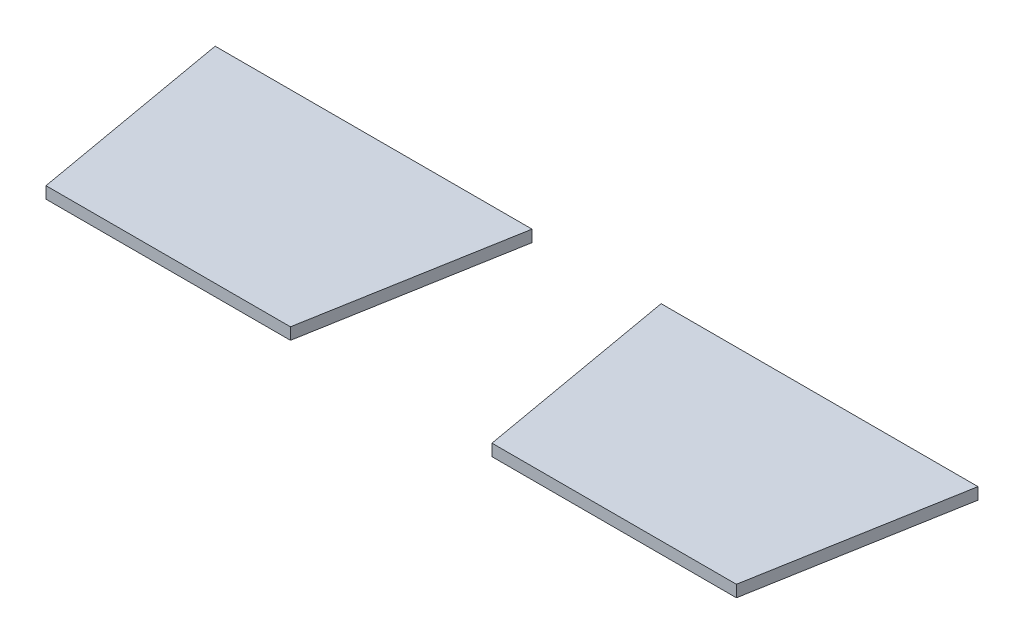
ISO-10303-21;
HEADER;
FILE_DESCRIPTION(('STEP AP214'),'2;1');
FILE_NAME('part.step','',(''),(''),'','','');
FILE_SCHEMA(('AUTOMOTIVE_DESIGN { 1 0 10303 214 1 1 1 1 }'));
ENDSEC;
DATA;
#1=APPLICATION_CONTEXT('core data for automotive mechanical design processes');
#2=APPLICATION_PROTOCOL_DEFINITION('international standard','automotive_design',2000,#1);
#3=PRODUCT_CONTEXT('',#1,'mechanical');
#4=PRODUCT('Part','Part','',(#3));
#5=PRODUCT_RELATED_PRODUCT_CATEGORY('part','',(#4));
#6=PRODUCT_DEFINITION_FORMATION('','',#4);
#7=PRODUCT_DEFINITION_CONTEXT('part definition',#1,'design');
#8=PRODUCT_DEFINITION('design','',#6,#7);
#9=PRODUCT_DEFINITION_SHAPE('','',#8);
#10=(LENGTH_UNIT() NAMED_UNIT(*) SI_UNIT(.MILLI.,.METRE.));
#11=(NAMED_UNIT(*) PLANE_ANGLE_UNIT() SI_UNIT($,.RADIAN.));
#12=(NAMED_UNIT(*) SI_UNIT($,.STERADIAN.) SOLID_ANGLE_UNIT());
#13=UNCERTAINTY_MEASURE_WITH_UNIT(LENGTH_MEASURE(1.E-05),#10,'distance_accuracy_value','');
#14=(GEOMETRIC_REPRESENTATION_CONTEXT(3) GLOBAL_UNCERTAINTY_ASSIGNED_CONTEXT((#13)) GLOBAL_UNIT_ASSIGNED_CONTEXT((#10,
#11,#12)) REPRESENTATION_CONTEXT('',''));
#15=CARTESIAN_POINT('',(0.,0.,0.));
#16=DIRECTION('',(0.,0.,1.));
#17=DIRECTION('',(1.,0.,0.));
#18=AXIS2_PLACEMENT_3D('',#15,#16,#17);
#19=CARTESIAN_POINT('',(65.,2.,-17.5));
#20=DIRECTION('',(0.,0.,1.));
#21=DIRECTION('',(1.,0.,0.));
#22=AXIS2_PLACEMENT_3D('',#19,#20,#21);
#23=PLANE('',#22);
#24=DIRECTION('',(-1.,0.,0.));
#25=VECTOR('',#24,1.);
#26=CARTESIAN_POINT('',(65.,0.,-17.5));
#27=LINE('',#26,#25);
#28=CARTESIAN_POINT('',(65.,0.,-17.5));
#29=VERTEX_POINT('',#28);
#30=CARTESIAN_POINT('',(11.,0.,-17.5));
#31=VERTEX_POINT('',#30);
#32=EDGE_CURVE('E106',#29,#31,#27,.T.);
#33=ORIENTED_EDGE('',*,*,#32,.T.);
#34=DIRECTION('',(0.,-1.,0.));
#35=VECTOR('',#34,1.);
#36=CARTESIAN_POINT('',(11.,2.,-17.5));
#37=LINE('',#36,#35);
#38=CARTESIAN_POINT('',(11.,2.,-17.5));
#39=VERTEX_POINT('',#38);
#40=EDGE_CURVE('E12',#39,#31,#37,.T.);
#41=ORIENTED_EDGE('',*,*,#40,.F.);
#42=DIRECTION('',(-1.,0.,0.));
#43=VECTOR('',#42,1.);
#44=CARTESIAN_POINT('',(65.,2.,-17.5));
#45=LINE('',#44,#43);
#46=CARTESIAN_POINT('',(65.,2.,-17.5));
#47=VERTEX_POINT('',#46);
#48=EDGE_CURVE('E94',#47,#39,#45,.T.);
#49=ORIENTED_EDGE('',*,*,#48,.F.);
#50=DIRECTION('',(0.,-1.,0.));
#51=VECTOR('',#50,1.);
#52=CARTESIAN_POINT('',(65.,2.,-17.5));
#53=LINE('',#52,#51);
#54=EDGE_CURVE('E102',#47,#29,#53,.T.);
#55=ORIENTED_EDGE('',*,*,#54,.T.);
#56=EDGE_LOOP('',(#33,#41,#49,#55));
#57=FACE_BOUND('',#56,.T.);
#58=ADVANCED_FACE('F43',(#57),#23,.F.);
#59=CARTESIAN_POINT('',(11.,2.,-17.5));
#60=DIRECTION('',(0.984807753012207,0.,-0.173648177666934));
#61=DIRECTION('',(-0.173648177666934,0.,-0.984807753012207));
#62=AXIS2_PLACEMENT_3D('',#59,#60,#61);
#63=PLANE('',#62);
#64=DIRECTION('',(0.173648177666934,0.,0.984807753012207));
#65=VECTOR('',#64,1.);
#66=CARTESIAN_POINT('',(11.,0.,-17.5));
#67=LINE('',#66,#65);
#68=CARTESIAN_POINT('',(17.1714443247964,0.,17.5));
#69=VERTEX_POINT('',#68);
#70=EDGE_CURVE('E98',#31,#69,#67,.T.);
#71=ORIENTED_EDGE('',*,*,#70,.T.);
#72=DIRECTION('',(0.,-1.,0.));
#73=VECTOR('',#72,1.);
#74=CARTESIAN_POINT('',(17.1714443247964,2.,17.5));
#75=LINE('',#74,#73);
#76=CARTESIAN_POINT('',(17.1714443247964,2.,17.5));
#77=VERTEX_POINT('',#76);
#78=EDGE_CURVE('E51',#77,#69,#75,.T.);
#79=ORIENTED_EDGE('',*,*,#78,.F.);
#80=DIRECTION('',(0.173648177666934,0.,0.984807753012207));
#81=VECTOR('',#80,1.);
#82=CARTESIAN_POINT('',(11.,2.,-17.5));
#83=LINE('',#82,#81);
#84=EDGE_CURVE('E89',#39,#77,#83,.T.);
#85=ORIENTED_EDGE('',*,*,#84,.F.);
#86=ORIENTED_EDGE('',*,*,#40,.T.);
#87=EDGE_LOOP('',(#71,#79,#85,#86));
#88=FACE_BOUND('',#87,.T.);
#89=ADVANCED_FACE('F97',(#88),#63,.F.);
#90=CARTESIAN_POINT('',(58.8285556752037,2.,17.5));
#91=DIRECTION('',(0.,0.,-1.));
#92=DIRECTION('',(-1.,0.,0.));
#93=AXIS2_PLACEMENT_3D('',#90,#91,#92);
#94=PLANE('',#93);
#95=DIRECTION('',(1.,0.,0.));
#96=VECTOR('',#95,1.);
#97=CARTESIAN_POINT('',(58.8285556752037,0.,17.5));
#98=LINE('',#97,#96);
#99=CARTESIAN_POINT('',(58.8285556752037,0.,17.5));
#100=VERTEX_POINT('',#99);
#101=EDGE_CURVE('E76',#69,#100,#98,.T.);
#102=ORIENTED_EDGE('',*,*,#101,.T.);
#103=DIRECTION('',(0.,-1.,0.));
#104=VECTOR('',#103,1.);
#105=CARTESIAN_POINT('',(58.8285556752037,2.,17.5));
#106=LINE('',#105,#104);
#107=CARTESIAN_POINT('',(58.8285556752037,2.,17.5));
#108=VERTEX_POINT('',#107);
#109=EDGE_CURVE('E99',#108,#100,#106,.T.);
#110=ORIENTED_EDGE('',*,*,#109,.F.);
#111=DIRECTION('',(1.,0.,0.));
#112=VECTOR('',#111,1.);
#113=CARTESIAN_POINT('',(58.8285556752037,2.,17.5));
#114=LINE('',#113,#112);
#115=EDGE_CURVE('E92',#77,#108,#114,.T.);
#116=ORIENTED_EDGE('',*,*,#115,.F.);
#117=ORIENTED_EDGE('',*,*,#78,.T.);
#118=EDGE_LOOP('',(#102,#110,#116,#117));
#119=FACE_BOUND('',#118,.T.);
#120=ADVANCED_FACE('F100',(#119),#94,.F.);
#121=CARTESIAN_POINT('',(65.,2.,-17.5));
#122=DIRECTION('',(-0.984807753012208,0.,-0.173648177666931));
#123=DIRECTION('',(-0.173648177666931,0.,0.984807753012208));
#124=AXIS2_PLACEMENT_3D('',#121,#122,#123);
#125=PLANE('',#124);
#126=DIRECTION('',(0.173648177666931,0.,-0.984807753012208));
#127=VECTOR('',#126,1.);
#128=CARTESIAN_POINT('',(65.,0.,-17.5));
#129=LINE('',#128,#127);
#130=EDGE_CURVE('E82',#100,#29,#129,.T.);
#131=ORIENTED_EDGE('',*,*,#130,.T.);
#132=ORIENTED_EDGE('',*,*,#54,.F.);
#133=DIRECTION('',(0.173648177666931,0.,-0.984807753012208));
#134=VECTOR('',#133,1.);
#135=CARTESIAN_POINT('',(65.,2.,-17.5));
#136=LINE('',#135,#134);
#137=EDGE_CURVE('E59',#108,#47,#136,.T.);
#138=ORIENTED_EDGE('',*,*,#137,.F.);
#139=ORIENTED_EDGE('',*,*,#109,.T.);
#140=EDGE_LOOP('',(#131,#132,#138,#139));
#141=FACE_BOUND('',#140,.T.);
#142=ADVANCED_FACE('F113',(#141),#125,.F.);
#143=CARTESIAN_POINT('',(0.,2.,0.));
#144=DIRECTION('',(0.,1.,0.));
#145=DIRECTION('',(0.,0.,1.));
#146=AXIS2_PLACEMENT_3D('',#143,#144,#145);
#147=PLANE('',#146);
#148=ORIENTED_EDGE('',*,*,#48,.T.);
#149=ORIENTED_EDGE('',*,*,#84,.T.);
#150=ORIENTED_EDGE('',*,*,#115,.T.);
#151=ORIENTED_EDGE('',*,*,#137,.T.);
#152=EDGE_LOOP('',(#148,#149,#150,#151));
#153=FACE_BOUND('',#152,.T.);
#154=ADVANCED_FACE('F90',(#153),#147,.T.);
#155=CARTESIAN_POINT('',(0.,0.,0.));
#156=DIRECTION('',(0.,1.,0.));
#157=DIRECTION('',(0.,0.,1.));
#158=AXIS2_PLACEMENT_3D('',#155,#156,#157);
#159=PLANE('',#158);
#160=ORIENTED_EDGE('',*,*,#32,.F.);
#161=ORIENTED_EDGE('',*,*,#130,.F.);
#162=ORIENTED_EDGE('',*,*,#101,.F.);
#163=ORIENTED_EDGE('',*,*,#70,.F.);
#164=EDGE_LOOP('',(#160,#161,#162,#163));
#165=FACE_BOUND('',#164,.T.);
#166=ADVANCED_FACE('F116',(#165),#159,.F.);
#167=CLOSED_SHELL('',(#58,#89,#120,#142,#154,#166));
#168=MANIFOLD_SOLID_BREP('B2',#167);
#169=CARTESIAN_POINT('',(-65.,2.,-17.5));
#170=DIRECTION('',(0.,0.,1.));
#171=DIRECTION('',(1.,0.,0.));
#172=AXIS2_PLACEMENT_3D('',#169,#170,#171);
#173=PLANE('',#172);
#174=DIRECTION('',(-1.,0.,0.));
#175=VECTOR('',#174,1.);
#176=CARTESIAN_POINT('',(-65.,0.,-17.5));
#177=LINE('',#176,#175);
#178=CARTESIAN_POINT('',(-11.,0.,-17.5));
#179=VERTEX_POINT('',#178);
#180=CARTESIAN_POINT('',(-65.,0.,-17.5));
#181=VERTEX_POINT('',#180);
#182=EDGE_CURVE('E230',#179,#181,#177,.T.);
#183=ORIENTED_EDGE('',*,*,#182,.T.);
#184=DIRECTION('',(0.,-1.,0.));
#185=VECTOR('',#184,1.);
#186=CARTESIAN_POINT('',(-65.,2.,-17.5));
#187=LINE('',#186,#185);
#188=CARTESIAN_POINT('',(-65.,2.,-17.5));
#189=VERTEX_POINT('',#188);
#190=EDGE_CURVE('E41',#189,#181,#187,.T.);
#191=ORIENTED_EDGE('',*,*,#190,.F.);
#192=DIRECTION('',(-1.,0.,0.));
#193=VECTOR('',#192,1.);
#194=CARTESIAN_POINT('',(-65.,2.,-17.5));
#195=LINE('',#194,#193);
#196=CARTESIAN_POINT('',(-11.,2.,-17.5));
#197=VERTEX_POINT('',#196);
#198=EDGE_CURVE('E218',#197,#189,#195,.T.);
#199=ORIENTED_EDGE('',*,*,#198,.F.);
#200=DIRECTION('',(0.,-1.,0.));
#201=VECTOR('',#200,1.);
#202=CARTESIAN_POINT('',(-11.,2.,-17.5));
#203=LINE('',#202,#201);
#204=EDGE_CURVE('E226',#197,#179,#203,.T.);
#205=ORIENTED_EDGE('',*,*,#204,.T.);
#206=EDGE_LOOP('',(#183,#191,#199,#205));
#207=FACE_BOUND('',#206,.T.);
#208=ADVANCED_FACE('F167',(#207),#173,.F.);
#209=CARTESIAN_POINT('',(-65.,2.,-17.5));
#210=DIRECTION('',(0.984807753012208,0.,-0.173648177666931));
#211=DIRECTION('',(-0.173648177666931,0.,-0.984807753012208));
#212=AXIS2_PLACEMENT_3D('',#209,#210,#211);
#213=PLANE('',#212);
#214=DIRECTION('',(0.173648177666931,0.,0.984807753012208));
#215=VECTOR('',#214,1.);
#216=CARTESIAN_POINT('',(-65.,0.,-17.5));
#217=LINE('',#216,#215);
#218=CARTESIAN_POINT('',(-58.8285556752037,0.,17.5));
#219=VERTEX_POINT('',#218);
#220=EDGE_CURVE('E222',#181,#219,#217,.T.);
#221=ORIENTED_EDGE('',*,*,#220,.T.);
#222=DIRECTION('',(0.,-1.,0.));
#223=VECTOR('',#222,1.);
#224=CARTESIAN_POINT('',(-58.8285556752037,2.,17.5));
#225=LINE('',#224,#223);
#226=CARTESIAN_POINT('',(-58.8285556752037,2.,17.5));
#227=VERTEX_POINT('',#226);
#228=EDGE_CURVE('E175',#227,#219,#225,.T.);
#229=ORIENTED_EDGE('',*,*,#228,.F.);
#230=DIRECTION('',(0.173648177666931,0.,0.984807753012208));
#231=VECTOR('',#230,1.);
#232=CARTESIAN_POINT('',(-65.,2.,-17.5));
#233=LINE('',#232,#231);
#234=EDGE_CURVE('E213',#189,#227,#233,.T.);
#235=ORIENTED_EDGE('',*,*,#234,.F.);
#236=ORIENTED_EDGE('',*,*,#190,.T.);
#237=EDGE_LOOP('',(#221,#229,#235,#236));
#238=FACE_BOUND('',#237,.T.);
#239=ADVANCED_FACE('F221',(#238),#213,.F.);
#240=CARTESIAN_POINT('',(-58.8285556752037,2.,17.5));
#241=DIRECTION('',(0.,0.,-1.));
#242=DIRECTION('',(-1.,0.,0.));
#243=AXIS2_PLACEMENT_3D('',#240,#241,#242);
#244=PLANE('',#243);
#245=DIRECTION('',(1.,0.,0.));
#246=VECTOR('',#245,1.);
#247=CARTESIAN_POINT('',(-58.8285556752037,0.,17.5));
#248=LINE('',#247,#246);
#249=CARTESIAN_POINT('',(-17.1714443247964,0.,17.5));
#250=VERTEX_POINT('',#249);
#251=EDGE_CURVE('E200',#219,#250,#248,.T.);
#252=ORIENTED_EDGE('',*,*,#251,.T.);
#253=DIRECTION('',(0.,-1.,0.));
#254=VECTOR('',#253,1.);
#255=CARTESIAN_POINT('',(-17.1714443247964,2.,17.5));
#256=LINE('',#255,#254);
#257=CARTESIAN_POINT('',(-17.1714443247964,2.,17.5));
#258=VERTEX_POINT('',#257);
#259=EDGE_CURVE('E223',#258,#250,#256,.T.);
#260=ORIENTED_EDGE('',*,*,#259,.F.);
#261=DIRECTION('',(1.,0.,0.));
#262=VECTOR('',#261,1.);
#263=CARTESIAN_POINT('',(-58.8285556752037,2.,17.5));
#264=LINE('',#263,#262);
#265=EDGE_CURVE('E216',#227,#258,#264,.T.);
#266=ORIENTED_EDGE('',*,*,#265,.F.);
#267=ORIENTED_EDGE('',*,*,#228,.T.);
#268=EDGE_LOOP('',(#252,#260,#266,#267));
#269=FACE_BOUND('',#268,.T.);
#270=ADVANCED_FACE('F224',(#269),#244,.F.);
#271=CARTESIAN_POINT('',(-11.,2.,-17.5));
#272=DIRECTION('',(-0.984807753012207,0.,-0.173648177666934));
#273=DIRECTION('',(-0.173648177666934,0.,0.984807753012207));
#274=AXIS2_PLACEMENT_3D('',#271,#272,#273);
#275=PLANE('',#274);
#276=DIRECTION('',(0.173648177666934,0.,-0.984807753012207));
#277=VECTOR('',#276,1.);
#278=CARTESIAN_POINT('',(-11.,0.,-17.5));
#279=LINE('',#278,#277);
#280=EDGE_CURVE('E206',#250,#179,#279,.T.);
#281=ORIENTED_EDGE('',*,*,#280,.T.);
#282=ORIENTED_EDGE('',*,*,#204,.F.);
#283=DIRECTION('',(0.173648177666934,0.,-0.984807753012207));
#284=VECTOR('',#283,1.);
#285=CARTESIAN_POINT('',(-11.,2.,-17.5));
#286=LINE('',#285,#284);
#287=EDGE_CURVE('E183',#258,#197,#286,.T.);
#288=ORIENTED_EDGE('',*,*,#287,.F.);
#289=ORIENTED_EDGE('',*,*,#259,.T.);
#290=EDGE_LOOP('',(#281,#282,#288,#289));
#291=FACE_BOUND('',#290,.T.);
#292=ADVANCED_FACE('F237',(#291),#275,.F.);
#293=CARTESIAN_POINT('',(0.,2.,0.));
#294=DIRECTION('',(0.,-1.,0.));
#295=DIRECTION('',(0.,0.,-1.));
#296=AXIS2_PLACEMENT_3D('',#293,#294,#295);
#297=PLANE('',#296);
#298=ORIENTED_EDGE('',*,*,#198,.T.);
#299=ORIENTED_EDGE('',*,*,#234,.T.);
#300=ORIENTED_EDGE('',*,*,#265,.T.);
#301=ORIENTED_EDGE('',*,*,#287,.T.);
#302=EDGE_LOOP('',(#298,#299,#300,#301));
#303=FACE_BOUND('',#302,.T.);
#304=ADVANCED_FACE('F214',(#303),#297,.F.);
#305=CARTESIAN_POINT('',(0.,0.,0.));
#306=DIRECTION('',(0.,-1.,0.));
#307=DIRECTION('',(0.,0.,-1.));
#308=AXIS2_PLACEMENT_3D('',#305,#306,#307);
#309=PLANE('',#308);
#310=ORIENTED_EDGE('',*,*,#182,.F.);
#311=ORIENTED_EDGE('',*,*,#280,.F.);
#312=ORIENTED_EDGE('',*,*,#251,.F.);
#313=ORIENTED_EDGE('',*,*,#220,.F.);
#314=EDGE_LOOP('',(#310,#311,#312,#313));
#315=FACE_BOUND('',#314,.T.);
#316=ADVANCED_FACE('F240',(#315),#309,.T.);
#317=CLOSED_SHELL('',(#208,#239,#270,#292,#304,#316));
#318=MANIFOLD_SOLID_BREP('B6',#317);
#319=ADVANCED_BREP_SHAPE_REPRESENTATION('',(#18,#168,#318),#14);
#320=SHAPE_DEFINITION_REPRESENTATION(#9,#319);
ENDSEC;
END-ISO-10303-21;
